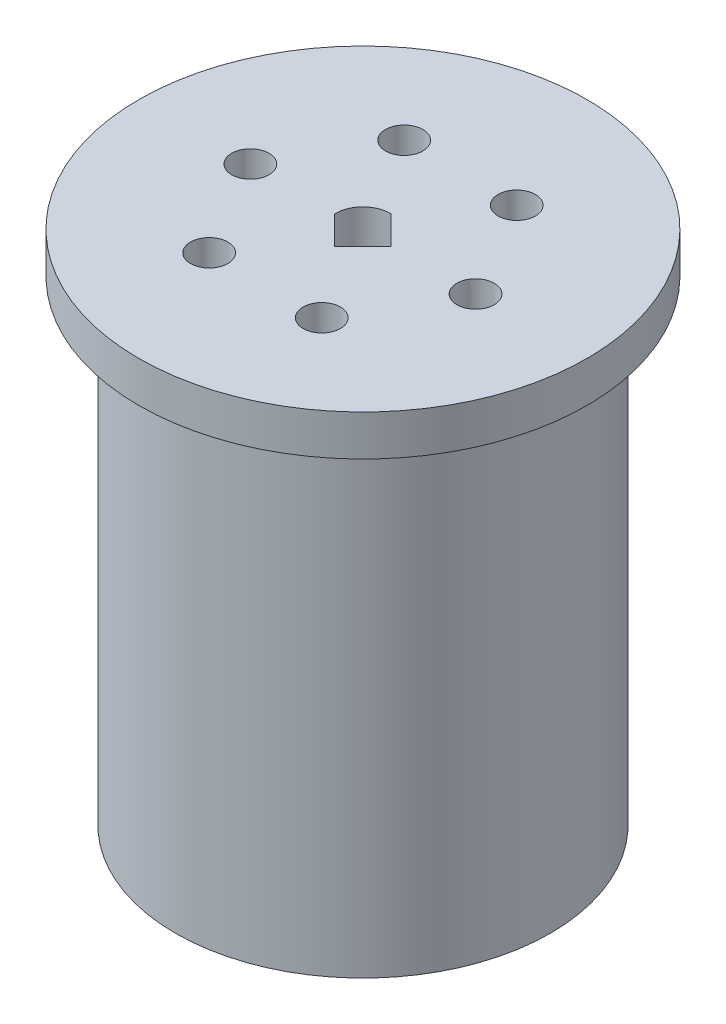
ISO-10303-21;
HEADER;
FILE_DESCRIPTION(('STEP AP214'),'2;1');
FILE_NAME('part.step','',(''),(''),'','','');
FILE_SCHEMA(('AUTOMOTIVE_DESIGN { 1 0 10303 214 1 1 1 1 }'));
ENDSEC;
DATA;
#1=APPLICATION_CONTEXT('core data for automotive mechanical design processes');
#2=APPLICATION_PROTOCOL_DEFINITION('international standard','automotive_design',2000,#1);
#3=PRODUCT_CONTEXT('',#1,'mechanical');
#4=PRODUCT('Part','Part','',(#3));
#5=PRODUCT_RELATED_PRODUCT_CATEGORY('part','',(#4));
#6=PRODUCT_DEFINITION_FORMATION('','',#4);
#7=PRODUCT_DEFINITION_CONTEXT('part definition',#1,'design');
#8=PRODUCT_DEFINITION('design','',#6,#7);
#9=PRODUCT_DEFINITION_SHAPE('','',#8);
#10=(LENGTH_UNIT() NAMED_UNIT(*) SI_UNIT(.MILLI.,.METRE.));
#11=(NAMED_UNIT(*) PLANE_ANGLE_UNIT() SI_UNIT($,.RADIAN.));
#12=(NAMED_UNIT(*) SI_UNIT($,.STERADIAN.) SOLID_ANGLE_UNIT());
#13=UNCERTAINTY_MEASURE_WITH_UNIT(LENGTH_MEASURE(1.E-05),#10,'distance_accuracy_value','');
#14=(GEOMETRIC_REPRESENTATION_CONTEXT(3) GLOBAL_UNCERTAINTY_ASSIGNED_CONTEXT((#13)) GLOBAL_UNIT_ASSIGNED_CONTEXT((#10,
#11,#12)) REPRESENTATION_CONTEXT('',''));
#15=CARTESIAN_POINT('',(0.,0.,0.));
#16=DIRECTION('',(0.,0.,1.));
#17=DIRECTION('',(1.,0.,0.));
#18=AXIS2_PLACEMENT_3D('',#15,#16,#17);
#19=CARTESIAN_POINT('',(0.,70.,0.));
#20=DIRECTION('',(0.,-1.,0.));
#21=DIRECTION('',(0.,0.,-1.));
#22=AXIS2_PLACEMENT_3D('',#19,#20,#21);
#23=CYLINDRICAL_SURFACE('',#22,27.6);
#24=CARTESIAN_POINT('',(0.,70.,0.));
#25=DIRECTION('',(0.,1.,0.));
#26=DIRECTION('',(0.,0.,1.));
#27=AXIS2_PLACEMENT_3D('',#24,#25,#26);
#28=CIRCLE('',#27,27.6);
#29=CARTESIAN_POINT('',(0.,70.,27.6));
#30=VERTEX_POINT('',#29);
#31=EDGE_CURVE('E87',#30,#30,#28,.T.);
#32=ORIENTED_EDGE('',*,*,#31,.F.);
#33=EDGE_LOOP('',(#32));
#34=FACE_BOUND('',#33,.T.);
#35=CARTESIAN_POINT('',(0.,0.,0.));
#36=DIRECTION('',(0.,1.,0.));
#37=DIRECTION('',(0.,0.,1.));
#38=AXIS2_PLACEMENT_3D('',#35,#36,#37);
#39=CIRCLE('',#38,27.6);
#40=CARTESIAN_POINT('',(0.,0.,27.6));
#41=VERTEX_POINT('',#40);
#42=EDGE_CURVE('E114',#41,#41,#39,.T.);
#43=ORIENTED_EDGE('',*,*,#42,.T.);
#44=EDGE_LOOP('',(#43));
#45=FACE_BOUND('',#44,.T.);
#46=ADVANCED_FACE('F36',(#34,#45),#23,.T.);
#47=CARTESIAN_POINT('',(0.,0.,0.));
#48=DIRECTION('',(0.,1.,0.));
#49=DIRECTION('',(0.,0.,1.));
#50=AXIS2_PLACEMENT_3D('',#47,#48,#49);
#51=PLANE('',#50);
#52=CARTESIAN_POINT('',(8.28674999999986,0.,-14.3530720296215));
#53=DIRECTION('',(0.,1.,0.));
#54=DIRECTION('',(0.,0.,1.));
#55=AXIS2_PLACEMENT_3D('',#52,#53,#54);
#56=CIRCLE('',#55,2.75);
#57=CARTESIAN_POINT('',(8.28674999999986,0.,-11.6030720296215));
#58=VERTEX_POINT('',#57);
#59=EDGE_CURVE('E95',#58,#58,#56,.T.);
#60=ORIENTED_EDGE('',*,*,#59,.T.);
#61=EDGE_LOOP('',(#60));
#62=FACE_BOUND('',#61,.T.);
#63=CARTESIAN_POINT('',(16.5735,0.,0.));
#64=DIRECTION('',(0.,1.,0.));
#65=DIRECTION('',(0.,0.,1.));
#66=AXIS2_PLACEMENT_3D('',#63,#64,#65);
#67=CIRCLE('',#66,2.75);
#68=CARTESIAN_POINT('',(16.5735,0.,2.75));
#69=VERTEX_POINT('',#68);
#70=EDGE_CURVE('E98',#69,#69,#67,.T.);
#71=ORIENTED_EDGE('',*,*,#70,.T.);
#72=EDGE_LOOP('',(#71));
#73=FACE_BOUND('',#72,.T.);
#74=CARTESIAN_POINT('',(8.28675000000006,0.,14.3530720296214));
#75=DIRECTION('',(0.,1.,0.));
#76=DIRECTION('',(0.,0.,1.));
#77=AXIS2_PLACEMENT_3D('',#74,#75,#76);
#78=CIRCLE('',#77,2.75);
#79=CARTESIAN_POINT('',(8.28675000000006,0.,17.1030720296214));
#80=VERTEX_POINT('',#79);
#81=EDGE_CURVE('E101',#80,#80,#78,.T.);
#82=ORIENTED_EDGE('',*,*,#81,.T.);
#83=EDGE_LOOP('',(#82));
#84=FACE_BOUND('',#83,.T.);
#85=CARTESIAN_POINT('',(-8.28674999999996,0.,14.3530720296214));
#86=DIRECTION('',(0.,1.,0.));
#87=DIRECTION('',(0.,0.,1.));
#88=AXIS2_PLACEMENT_3D('',#85,#86,#87);
#89=CIRCLE('',#88,2.75);
#90=CARTESIAN_POINT('',(-8.28674999999996,0.,17.1030720296214));
#91=VERTEX_POINT('',#90);
#92=EDGE_CURVE('E104',#91,#91,#89,.T.);
#93=ORIENTED_EDGE('',*,*,#92,.T.);
#94=EDGE_LOOP('',(#93));
#95=FACE_BOUND('',#94,.T.);
#96=CARTESIAN_POINT('',(-16.5735,0.,0.));
#97=DIRECTION('',(0.,1.,0.));
#98=DIRECTION('',(0.,0.,1.));
#99=AXIS2_PLACEMENT_3D('',#96,#97,#98);
#100=CIRCLE('',#99,2.75);
#101=CARTESIAN_POINT('',(-16.5735,0.,2.75));
#102=VERTEX_POINT('',#101);
#103=EDGE_CURVE('E107',#102,#102,#100,.T.);
#104=ORIENTED_EDGE('',*,*,#103,.T.);
#105=EDGE_LOOP('',(#104));
#106=FACE_BOUND('',#105,.T.);
#107=CARTESIAN_POINT('',(-8.28675000000016,0.,-14.3530720296213));
#108=DIRECTION('',(0.,1.,0.));
#109=DIRECTION('',(0.,0.,1.));
#110=AXIS2_PLACEMENT_3D('',#107,#108,#109);
#111=CIRCLE('',#110,2.75);
#112=CARTESIAN_POINT('',(-8.28675000000016,0.,-11.6030720296213));
#113=VERTEX_POINT('',#112);
#114=EDGE_CURVE('E110',#113,#113,#111,.T.);
#115=ORIENTED_EDGE('',*,*,#114,.T.);
#116=EDGE_LOOP('',(#115));
#117=FACE_BOUND('',#116,.T.);
#118=DIRECTION('',(0.707106781186548,0.,0.707106781186548));
#119=VECTOR('',#118,1.);
#120=CARTESIAN_POINT('',(0.162994526428276,0.,-3.99667771834989));
#121=LINE('',#120,#119);
#122=CARTESIAN_POINT('',(0.162994526428276,0.,-3.99667771834989));
#123=VERTEX_POINT('',#122);
#124=CARTESIAN_POINT('',(4.31410678146069,0.,0.154434536682526));
#125=VERTEX_POINT('',#124);
#126=EDGE_CURVE('E129',#123,#125,#121,.T.);
#127=ORIENTED_EDGE('',*,*,#126,.F.);
#128=CARTESIAN_POINT('',(0.,0.,0.));
#129=DIRECTION('',(0.,-1.,0.));
#130=DIRECTION('',(0.,0.,-1.));
#131=AXIS2_PLACEMENT_3D('',#128,#129,#130);
#132=CIRCLE('',#131,4.);
#133=CARTESIAN_POINT('',(-3.99701773064231,0.,0.154432059272016));
#134=VERTEX_POINT('',#133);
#135=EDGE_CURVE('E58',#134,#123,#132,.T.);
#136=ORIENTED_EDGE('',*,*,#135,.F.);
#137=DIRECTION('',(0.707106781186548,0.,0.707106781186548));
#138=VECTOR('',#137,1.);
#139=CARTESIAN_POINT('',(-3.99701773064231,0.,0.154432059272016));
#140=LINE('',#139,#138);
#141=CARTESIAN_POINT('',(0.158545764114442,0.,4.30999555402877));
#142=VERTEX_POINT('',#141);
#143=EDGE_CURVE('E79',#134,#142,#140,.T.);
#144=ORIENTED_EDGE('',*,*,#143,.T.);
#145=DIRECTION('',(0.707106781186547,0.,-0.707106781186547));
#146=VECTOR('',#145,1.);
#147=CARTESIAN_POINT('',(0.158545764114442,0.,4.30999555402877));
#148=LINE('',#147,#146);
#149=EDGE_CURVE('E126',#142,#125,#148,.T.);
#150=ORIENTED_EDGE('',*,*,#149,.T.);
#151=EDGE_LOOP('',(#127,#136,#144,#150));
#152=FACE_BOUND('',#151,.T.);
#153=ORIENTED_EDGE('',*,*,#42,.F.);
#154=EDGE_LOOP('',(#153));
#155=FACE_BOUND('',#154,.T.);
#156=ADVANCED_FACE('F183',(#62,#73,#84,#95,#106,#117,#152,#155),#51,.F.);
#157=CARTESIAN_POINT('',(0.,50.,0.));
#158=DIRECTION('',(0.,-1.,0.));
#159=DIRECTION('',(0.,0.,-1.));
#160=AXIS2_PLACEMENT_3D('',#157,#158,#159);
#161=CYLINDRICAL_SURFACE('',#160,4.);
#162=ORIENTED_EDGE('',*,*,#135,.T.);
#163=DIRECTION('',(0.,-1.,0.));
#164=VECTOR('',#163,1.);
#165=CARTESIAN_POINT('',(0.162994526428276,50.,-3.99667771834989));
#166=LINE('',#165,#164);
#167=CARTESIAN_POINT('',(0.162994526428276,76.,-3.99667771834989));
#168=VERTEX_POINT('',#167);
#169=EDGE_CURVE('E74',#168,#123,#166,.T.);
#170=ORIENTED_EDGE('',*,*,#169,.F.);
#171=CARTESIAN_POINT('',(0.,76.,0.));
#172=DIRECTION('',(0.,1.,0.));
#173=DIRECTION('',(0.,0.,1.));
#174=AXIS2_PLACEMENT_3D('',#171,#172,#173);
#175=CIRCLE('',#174,4.);
#176=CARTESIAN_POINT('',(-3.99701773064231,76.,0.154432059272016));
#177=VERTEX_POINT('',#176);
#178=EDGE_CURVE('E11',#168,#177,#175,.T.);
#179=ORIENTED_EDGE('',*,*,#178,.T.);
#180=DIRECTION('',(0.,-1.,0.));
#181=VECTOR('',#180,1.);
#182=CARTESIAN_POINT('',(-3.99701773064231,50.,0.154432059272016));
#183=LINE('',#182,#181);
#184=EDGE_CURVE('E117',#177,#134,#183,.T.);
#185=ORIENTED_EDGE('',*,*,#184,.T.);
#186=EDGE_LOOP('',(#162,#170,#179,#185));
#187=FACE_BOUND('',#186,.T.);
#188=ADVANCED_FACE('F75',(#187),#161,.F.);
#189=CARTESIAN_POINT('',(-3.99701773064231,50.,0.154432059272016));
#190=DIRECTION('',(0.707106781186548,0.,-0.707106781186548));
#191=DIRECTION('',(-0.707106781186548,0.,-0.707106781186548));
#192=AXIS2_PLACEMENT_3D('',#189,#190,#191);
#193=PLANE('',#192);
#194=ORIENTED_EDGE('',*,*,#143,.F.);
#195=ORIENTED_EDGE('',*,*,#184,.F.);
#196=DIRECTION('',(-0.707106781186548,0.,-0.707106781186548));
#197=VECTOR('',#196,1.);
#198=CARTESIAN_POINT('',(-2.07572489495716,76.,2.07572489495716));
#199=LINE('',#198,#197);
#200=CARTESIAN_POINT('',(0.158545764114442,76.,4.30999555402877));
#201=VERTEX_POINT('',#200);
#202=EDGE_CURVE('E43',#201,#177,#199,.T.);
#203=ORIENTED_EDGE('',*,*,#202,.F.);
#204=DIRECTION('',(0.,-1.,0.));
#205=VECTOR('',#204,1.);
#206=CARTESIAN_POINT('',(0.158545764114442,50.,4.30999555402877));
#207=LINE('',#206,#205);
#208=EDGE_CURVE('E121',#201,#142,#207,.T.);
#209=ORIENTED_EDGE('',*,*,#208,.T.);
#210=EDGE_LOOP('',(#194,#195,#203,#209));
#211=FACE_BOUND('',#210,.T.);
#212=ADVANCED_FACE('F196',(#211),#193,.T.);
#213=CARTESIAN_POINT('',(0.158545764114442,50.,4.30999555402877));
#214=DIRECTION('',(-0.707106781186547,0.,-0.707106781186547));
#215=DIRECTION('',(-0.707106781186548,0.,0.707106781186548));
#216=AXIS2_PLACEMENT_3D('',#213,#214,#215);
#217=PLANE('',#216);
#218=ORIENTED_EDGE('',*,*,#149,.F.);
#219=ORIENTED_EDGE('',*,*,#208,.F.);
#220=DIRECTION('',(-0.707106781186548,0.,0.707106781186548));
#221=VECTOR('',#220,1.);
#222=CARTESIAN_POINT('',(2.23427065907161,76.,2.23427065907161));
#223=LINE('',#222,#221);
#224=CARTESIAN_POINT('',(4.31410678146069,76.,0.154434536682526));
#225=VERTEX_POINT('',#224);
#226=EDGE_CURVE('E86',#225,#201,#223,.T.);
#227=ORIENTED_EDGE('',*,*,#226,.F.);
#228=DIRECTION('',(0.,-1.,0.));
#229=VECTOR('',#228,1.);
#230=CARTESIAN_POINT('',(4.31410678146069,50.,0.154434536682526));
#231=LINE('',#230,#229);
#232=EDGE_CURVE('E50',#225,#125,#231,.T.);
#233=ORIENTED_EDGE('',*,*,#232,.T.);
#234=EDGE_LOOP('',(#218,#219,#227,#233));
#235=FACE_BOUND('',#234,.T.);
#236=ADVANCED_FACE('F203',(#235),#217,.T.);
#237=CARTESIAN_POINT('',(0.162994526428276,50.,-3.99667771834989));
#238=DIRECTION('',(0.707106781186548,0.,-0.707106781186548));
#239=DIRECTION('',(-0.707106781186548,0.,-0.707106781186548));
#240=AXIS2_PLACEMENT_3D('',#237,#238,#239);
#241=PLANE('',#240);
#242=ORIENTED_EDGE('',*,*,#126,.T.);
#243=ORIENTED_EDGE('',*,*,#232,.F.);
#244=DIRECTION('',(-0.707106781186548,0.,-0.707106781186548));
#245=VECTOR('',#244,1.);
#246=CARTESIAN_POINT('',(2.07983612238908,76.,-2.07983612238908));
#247=LINE('',#246,#245);
#248=EDGE_CURVE('E82',#225,#168,#247,.T.);
#249=ORIENTED_EDGE('',*,*,#248,.T.);
#250=ORIENTED_EDGE('',*,*,#169,.T.);
#251=EDGE_LOOP('',(#242,#243,#249,#250));
#252=FACE_BOUND('',#251,.T.);
#253=ADVANCED_FACE('F83',(#252),#241,.F.);
#254=CARTESIAN_POINT('',(-8.28675000000016,-40.,-14.3530720296213));
#255=DIRECTION('',(0.,1.,0.));
#256=DIRECTION('',(0.,0.,1.));
#257=AXIS2_PLACEMENT_3D('',#254,#255,#256);
#258=CYLINDRICAL_SURFACE('',#257,2.75);
#259=ORIENTED_EDGE('',*,*,#114,.F.);
#260=EDGE_LOOP('',(#259));
#261=FACE_BOUND('',#260,.T.);
#262=CARTESIAN_POINT('',(-8.28675000000016,76.,-14.3530720296213));
#263=DIRECTION('',(0.,1.,0.));
#264=DIRECTION('',(0.,0.,1.));
#265=AXIS2_PLACEMENT_3D('',#262,#263,#264);
#266=CIRCLE('',#265,2.75);
#267=CARTESIAN_POINT('',(-8.28675000000016,76.,-11.6030720296213));
#268=VERTEX_POINT('',#267);
#269=EDGE_CURVE('E135',#268,#268,#266,.T.);
#270=ORIENTED_EDGE('',*,*,#269,.T.);
#271=EDGE_LOOP('',(#270));
#272=FACE_BOUND('',#271,.T.);
#273=ADVANCED_FACE('F202',(#261,#272),#258,.F.);
#274=CARTESIAN_POINT('',(-16.5735,-40.,0.));
#275=DIRECTION('',(0.,1.,0.));
#276=DIRECTION('',(0.,0.,1.));
#277=AXIS2_PLACEMENT_3D('',#274,#275,#276);
#278=CYLINDRICAL_SURFACE('',#277,2.75);
#279=ORIENTED_EDGE('',*,*,#103,.F.);
#280=EDGE_LOOP('',(#279));
#281=FACE_BOUND('',#280,.T.);
#282=CARTESIAN_POINT('',(-16.5735,76.,0.));
#283=DIRECTION('',(0.,1.,0.));
#284=DIRECTION('',(0.,0.,1.));
#285=AXIS2_PLACEMENT_3D('',#282,#283,#284);
#286=CIRCLE('',#285,2.75);
#287=CARTESIAN_POINT('',(-16.5735,76.,2.75));
#288=VERTEX_POINT('',#287);
#289=EDGE_CURVE('E140',#288,#288,#286,.T.);
#290=ORIENTED_EDGE('',*,*,#289,.T.);
#291=EDGE_LOOP('',(#290));
#292=FACE_BOUND('',#291,.T.);
#293=ADVANCED_FACE('F156',(#281,#292),#278,.F.);
#294=CARTESIAN_POINT('',(-8.28674999999996,-40.,14.3530720296214));
#295=DIRECTION('',(0.,1.,0.));
#296=DIRECTION('',(0.,0.,1.));
#297=AXIS2_PLACEMENT_3D('',#294,#295,#296);
#298=CYLINDRICAL_SURFACE('',#297,2.75);
#299=ORIENTED_EDGE('',*,*,#92,.F.);
#300=EDGE_LOOP('',(#299));
#301=FACE_BOUND('',#300,.T.);
#302=CARTESIAN_POINT('',(-8.28674999999996,76.,14.3530720296214));
#303=DIRECTION('',(0.,1.,0.));
#304=DIRECTION('',(0.,0.,1.));
#305=AXIS2_PLACEMENT_3D('',#302,#303,#304);
#306=CIRCLE('',#305,2.75);
#307=CARTESIAN_POINT('',(-8.28674999999996,76.,17.1030720296214));
#308=VERTEX_POINT('',#307);
#309=EDGE_CURVE('E150',#308,#308,#306,.T.);
#310=ORIENTED_EDGE('',*,*,#309,.T.);
#311=EDGE_LOOP('',(#310));
#312=FACE_BOUND('',#311,.T.);
#313=ADVANCED_FACE('F218',(#301,#312),#298,.F.);
#314=CARTESIAN_POINT('',(8.28675000000006,-40.,14.3530720296214));
#315=DIRECTION('',(0.,1.,0.));
#316=DIRECTION('',(0.,0.,1.));
#317=AXIS2_PLACEMENT_3D('',#314,#315,#316);
#318=CYLINDRICAL_SURFACE('',#317,2.75);
#319=ORIENTED_EDGE('',*,*,#81,.F.);
#320=EDGE_LOOP('',(#319));
#321=FACE_BOUND('',#320,.T.);
#322=CARTESIAN_POINT('',(8.28675000000006,76.,14.3530720296214));
#323=DIRECTION('',(0.,1.,0.));
#324=DIRECTION('',(0.,0.,1.));
#325=AXIS2_PLACEMENT_3D('',#322,#323,#324);
#326=CIRCLE('',#325,2.75);
#327=CARTESIAN_POINT('',(8.28675000000006,76.,17.1030720296214));
#328=VERTEX_POINT('',#327);
#329=EDGE_CURVE('E147',#328,#328,#326,.T.);
#330=ORIENTED_EDGE('',*,*,#329,.T.);
#331=EDGE_LOOP('',(#330));
#332=FACE_BOUND('',#331,.T.);
#333=ADVANCED_FACE('F214',(#321,#332),#318,.F.);
#334=CARTESIAN_POINT('',(16.5735,-40.,0.));
#335=DIRECTION('',(0.,1.,0.));
#336=DIRECTION('',(0.,0.,1.));
#337=AXIS2_PLACEMENT_3D('',#334,#335,#336);
#338=CYLINDRICAL_SURFACE('',#337,2.75);
#339=ORIENTED_EDGE('',*,*,#70,.F.);
#340=EDGE_LOOP('',(#339));
#341=FACE_BOUND('',#340,.T.);
#342=CARTESIAN_POINT('',(16.5735,76.,0.));
#343=DIRECTION('',(0.,1.,0.));
#344=DIRECTION('',(0.,0.,1.));
#345=AXIS2_PLACEMENT_3D('',#342,#343,#344);
#346=CIRCLE('',#345,2.75);
#347=CARTESIAN_POINT('',(16.5735,76.,2.75));
#348=VERTEX_POINT('',#347);
#349=EDGE_CURVE('E144',#348,#348,#346,.T.);
#350=ORIENTED_EDGE('',*,*,#349,.T.);
#351=EDGE_LOOP('',(#350));
#352=FACE_BOUND('',#351,.T.);
#353=ADVANCED_FACE('F179',(#341,#352),#338,.F.);
#354=CARTESIAN_POINT('',(8.28674999999986,-40.,-14.3530720296215));
#355=DIRECTION('',(0.,1.,0.));
#356=DIRECTION('',(0.,0.,1.));
#357=AXIS2_PLACEMENT_3D('',#354,#355,#356);
#358=CYLINDRICAL_SURFACE('',#357,2.75);
#359=ORIENTED_EDGE('',*,*,#59,.F.);
#360=EDGE_LOOP('',(#359));
#361=FACE_BOUND('',#360,.T.);
#362=CARTESIAN_POINT('',(8.28674999999986,76.,-14.3530720296215));
#363=DIRECTION('',(0.,1.,0.));
#364=DIRECTION('',(0.,0.,1.));
#365=AXIS2_PLACEMENT_3D('',#362,#363,#364);
#366=CIRCLE('',#365,2.75);
#367=CARTESIAN_POINT('',(8.28674999999986,76.,-11.6030720296215));
#368=VERTEX_POINT('',#367);
#369=EDGE_CURVE('E141',#368,#368,#366,.T.);
#370=ORIENTED_EDGE('',*,*,#369,.T.);
#371=EDGE_LOOP('',(#370));
#372=FACE_BOUND('',#371,.T.);
#373=ADVANCED_FACE('F173',(#361,#372),#358,.F.);
#374=CARTESIAN_POINT('',(0.,70.,0.));
#375=DIRECTION('',(0.,1.,0.));
#376=DIRECTION('',(0.,0.,1.));
#377=AXIS2_PLACEMENT_3D('',#374,#375,#376);
#378=PLANE('',#377);
#379=ORIENTED_EDGE('',*,*,#31,.T.);
#380=EDGE_LOOP('',(#379));
#381=FACE_BOUND('',#380,.T.);
#382=CARTESIAN_POINT('',(0.,70.,0.));
#383=DIRECTION('',(0.,1.,0.));
#384=DIRECTION('',(0.,0.,1.));
#385=AXIS2_PLACEMENT_3D('',#382,#383,#384);
#386=CIRCLE('',#385,33.);
#387=CARTESIAN_POINT('',(0.,70.,33.));
#388=VERTEX_POINT('',#387);
#389=EDGE_CURVE('E132',#388,#388,#386,.T.);
#390=ORIENTED_EDGE('',*,*,#389,.F.);
#391=EDGE_LOOP('',(#390));
#392=FACE_BOUND('',#391,.T.);
#393=ADVANCED_FACE('F161',(#381,#392),#378,.F.);
#394=CARTESIAN_POINT('',(0.,76.,0.));
#395=DIRECTION('',(0.,1.,0.));
#396=DIRECTION('',(0.,0.,1.));
#397=AXIS2_PLACEMENT_3D('',#394,#395,#396);
#398=PLANE('',#397);
#399=ORIENTED_EDGE('',*,*,#178,.F.);
#400=ORIENTED_EDGE('',*,*,#248,.F.);
#401=ORIENTED_EDGE('',*,*,#226,.T.);
#402=ORIENTED_EDGE('',*,*,#202,.T.);
#403=EDGE_LOOP('',(#399,#400,#401,#402));
#404=FACE_BOUND('',#403,.T.);
#405=ORIENTED_EDGE('',*,*,#369,.F.);
#406=EDGE_LOOP('',(#405));
#407=FACE_BOUND('',#406,.T.);
#408=ORIENTED_EDGE('',*,*,#349,.F.);
#409=EDGE_LOOP('',(#408));
#410=FACE_BOUND('',#409,.T.);
#411=ORIENTED_EDGE('',*,*,#329,.F.);
#412=EDGE_LOOP('',(#411));
#413=FACE_BOUND('',#412,.T.);
#414=ORIENTED_EDGE('',*,*,#309,.F.);
#415=EDGE_LOOP('',(#414));
#416=FACE_BOUND('',#415,.T.);
#417=ORIENTED_EDGE('',*,*,#289,.F.);
#418=EDGE_LOOP('',(#417));
#419=FACE_BOUND('',#418,.T.);
#420=ORIENTED_EDGE('',*,*,#269,.F.);
#421=EDGE_LOOP('',(#420));
#422=FACE_BOUND('',#421,.T.);
#423=CARTESIAN_POINT('',(0.,76.,0.));
#424=DIRECTION('',(0.,1.,0.));
#425=DIRECTION('',(0.,0.,1.));
#426=AXIS2_PLACEMENT_3D('',#423,#424,#425);
#427=CIRCLE('',#426,33.);
#428=CARTESIAN_POINT('',(0.,76.,33.));
#429=VERTEX_POINT('',#428);
#430=EDGE_CURVE('E113',#429,#429,#427,.T.);
#431=ORIENTED_EDGE('',*,*,#430,.T.);
#432=EDGE_LOOP('',(#431));
#433=FACE_BOUND('',#432,.T.);
#434=ADVANCED_FACE('F89',(#404,#407,#410,#413,#416,#419,#422,#433),#398,.T.);
#435=CARTESIAN_POINT('',(0.,76.,0.));
#436=DIRECTION('',(0.,-1.,0.));
#437=DIRECTION('',(0.,0.,-1.));
#438=AXIS2_PLACEMENT_3D('',#435,#436,#437);
#439=CYLINDRICAL_SURFACE('',#438,33.);
#440=ORIENTED_EDGE('',*,*,#430,.F.);
#441=EDGE_LOOP('',(#440));
#442=FACE_BOUND('',#441,.T.);
#443=ORIENTED_EDGE('',*,*,#389,.T.);
#444=EDGE_LOOP('',(#443));
#445=FACE_BOUND('',#444,.T.);
#446=ADVANCED_FACE('F160',(#442,#445),#439,.T.);
#447=CLOSED_SHELL('',(#46,#156,#188,#212,#236,#253,#273,#293,#313,#333,#353,#373,#393,#434,#446));
#448=MANIFOLD_SOLID_BREP('B2',#447);
#449=ADVANCED_BREP_SHAPE_REPRESENTATION('',(#18,#448),#14);
#450=SHAPE_DEFINITION_REPRESENTATION(#9,#449);
ENDSEC;
END-ISO-10303-21;
